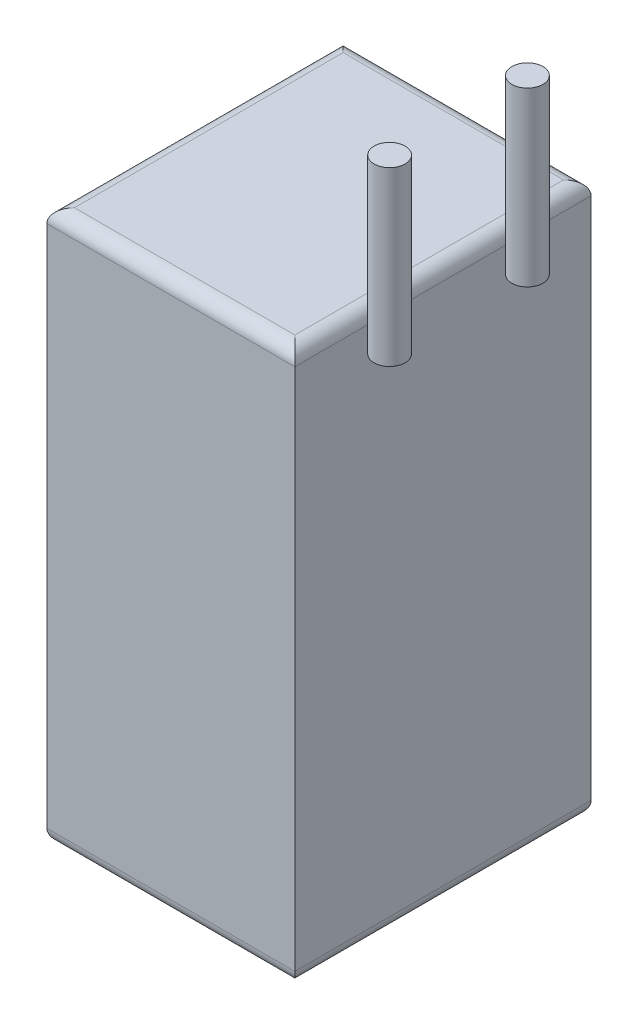
ISO-10303-21;
HEADER;
FILE_DESCRIPTION(('STEP AP214'),'2;1');
FILE_NAME('part.step','',(''),(''),'','','');
FILE_SCHEMA(('AUTOMOTIVE_DESIGN { 1 0 10303 214 1 1 1 1 }'));
ENDSEC;
DATA;
#1=APPLICATION_CONTEXT('core data for automotive mechanical design processes');
#2=APPLICATION_PROTOCOL_DEFINITION('international standard','automotive_design',2000,#1);
#3=PRODUCT_CONTEXT('',#1,'mechanical');
#4=PRODUCT('Part','Part','',(#3));
#5=PRODUCT_RELATED_PRODUCT_CATEGORY('part','',(#4));
#6=PRODUCT_DEFINITION_FORMATION('','',#4);
#7=PRODUCT_DEFINITION_CONTEXT('part definition',#1,'design');
#8=PRODUCT_DEFINITION('design','',#6,#7);
#9=PRODUCT_DEFINITION_SHAPE('','',#8);
#10=(LENGTH_UNIT() NAMED_UNIT(*) SI_UNIT(.MILLI.,.METRE.));
#11=(NAMED_UNIT(*) PLANE_ANGLE_UNIT() SI_UNIT($,.RADIAN.));
#12=(NAMED_UNIT(*) SI_UNIT($,.STERADIAN.) SOLID_ANGLE_UNIT());
#13=UNCERTAINTY_MEASURE_WITH_UNIT(LENGTH_MEASURE(1.E-05),#10,'distance_accuracy_value','');
#14=(GEOMETRIC_REPRESENTATION_CONTEXT(3) GLOBAL_UNCERTAINTY_ASSIGNED_CONTEXT((#13)) GLOBAL_UNIT_ASSIGNED_CONTEXT((#10,
#11,#12)) REPRESENTATION_CONTEXT('',''));
#15=CARTESIAN_POINT('',(0.,0.,0.));
#16=DIRECTION('',(0.,0.,1.));
#17=DIRECTION('',(1.,0.,0.));
#18=AXIS2_PLACEMENT_3D('',#15,#16,#17);
#19=CARTESIAN_POINT('',(20.25,75.,10.));
#20=DIRECTION('',(0.,1.,0.));
#21=DIRECTION('',(0.,0.,1.));
#22=AXIS2_PLACEMENT_3D('',#19,#20,#21);
#23=CYLINDRICAL_SURFACE('',#22,2.25);
#24=CARTESIAN_POINT('',(20.25,75.,10.));
#25=DIRECTION('',(0.,1.,0.));
#26=DIRECTION('',(0.,0.,-1.));
#27=AXIS2_PLACEMENT_3D('',#24,#25,#26);
#28=CIRCLE('',#27,2.25);
#29=CARTESIAN_POINT('',(20.25,75.,7.75));
#30=VERTEX_POINT('',#29);
#31=EDGE_CURVE('E11',#30,#30,#28,.T.);
#32=ORIENTED_EDGE('',*,*,#31,.T.);
#33=EDGE_LOOP('',(#32));
#34=FACE_BOUND('',#33,.T.);
#35=CARTESIAN_POINT('',(20.25,100.,10.));
#36=DIRECTION('',(0.,1.,0.));
#37=DIRECTION('',(0.,0.,-1.));
#38=AXIS2_PLACEMENT_3D('',#35,#36,#37);
#39=CIRCLE('',#38,2.25);
#40=CARTESIAN_POINT('',(20.25,100.,7.75));
#41=VERTEX_POINT('',#40);
#42=EDGE_CURVE('E54',#41,#41,#39,.T.);
#43=ORIENTED_EDGE('',*,*,#42,.F.);
#44=EDGE_LOOP('',(#43));
#45=FACE_BOUND('',#44,.T.);
#46=ADVANCED_FACE('F48',(#34,#45),#23,.T.);
#47=CARTESIAN_POINT('',(20.25,75.,10.));
#48=DIRECTION('',(0.,-1.,0.));
#49=DIRECTION('',(0.,0.,-1.));
#50=AXIS2_PLACEMENT_3D('',#47,#48,#49);
#51=PLANE('',#50);
#52=ORIENTED_EDGE('',*,*,#31,.F.);
#53=EDGE_LOOP('',(#52));
#54=FACE_BOUND('',#53,.T.);
#55=ADVANCED_FACE('F63',(#54),#51,.T.);
#56=CARTESIAN_POINT('',(20.25,100.,10.));
#57=DIRECTION('',(0.,-1.,0.));
#58=DIRECTION('',(0.,0.,-1.));
#59=AXIS2_PLACEMENT_3D('',#56,#57,#58);
#60=PLANE('',#59);
#61=ORIENTED_EDGE('',*,*,#42,.T.);
#62=EDGE_LOOP('',(#61));
#63=FACE_BOUND('',#62,.T.);
#64=ADVANCED_FACE('F60',(#63),#60,.F.);
#65=CLOSED_SHELL('',(#46,#55,#64));
#66=MANIFOLD_SOLID_BREP('B2',#65);
#67=CARTESIAN_POINT('',(20.25,75.,-10.));
#68=DIRECTION('',(0.,1.,0.));
#69=DIRECTION('',(0.,0.,1.));
#70=AXIS2_PLACEMENT_3D('',#67,#68,#69);
#71=CYLINDRICAL_SURFACE('',#70,2.25);
#72=CARTESIAN_POINT('',(20.25,75.,-10.));
#73=DIRECTION('',(0.,1.,0.));
#74=DIRECTION('',(0.,0.,1.));
#75=AXIS2_PLACEMENT_3D('',#72,#73,#74);
#76=CIRCLE('',#75,2.25);
#77=CARTESIAN_POINT('',(20.25,75.,-7.75));
#78=VERTEX_POINT('',#77);
#79=EDGE_CURVE('E47',#78,#78,#76,.T.);
#80=ORIENTED_EDGE('',*,*,#79,.T.);
#81=EDGE_LOOP('',(#80));
#82=FACE_BOUND('',#81,.T.);
#83=CARTESIAN_POINT('',(20.25,100.,-10.));
#84=DIRECTION('',(0.,1.,0.));
#85=DIRECTION('',(0.,0.,1.));
#86=AXIS2_PLACEMENT_3D('',#83,#84,#85);
#87=CIRCLE('',#86,2.25);
#88=CARTESIAN_POINT('',(20.25,100.,-7.75));
#89=VERTEX_POINT('',#88);
#90=EDGE_CURVE('E110',#89,#89,#87,.T.);
#91=ORIENTED_EDGE('',*,*,#90,.F.);
#92=EDGE_LOOP('',(#91));
#93=FACE_BOUND('',#92,.T.);
#94=ADVANCED_FACE('F104',(#82,#93),#71,.T.);
#95=CARTESIAN_POINT('',(20.25,75.,-10.));
#96=DIRECTION('',(0.,1.,0.));
#97=DIRECTION('',(0.,0.,1.));
#98=AXIS2_PLACEMENT_3D('',#95,#96,#97);
#99=PLANE('',#98);
#100=ORIENTED_EDGE('',*,*,#79,.F.);
#101=EDGE_LOOP('',(#100));
#102=FACE_BOUND('',#101,.T.);
#103=ADVANCED_FACE('F119',(#102),#99,.F.);
#104=CARTESIAN_POINT('',(20.25,100.,-10.));
#105=DIRECTION('',(0.,1.,0.));
#106=DIRECTION('',(0.,0.,1.));
#107=AXIS2_PLACEMENT_3D('',#104,#105,#106);
#108=PLANE('',#107);
#109=ORIENTED_EDGE('',*,*,#90,.T.);
#110=EDGE_LOOP('',(#109));
#111=FACE_BOUND('',#110,.T.);
#112=ADVANCED_FACE('F116',(#111),#108,.T.);
#113=CLOSED_SHELL('',(#94,#103,#112));
#114=MANIFOLD_SOLID_BREP('B6',#113);
#115=CARTESIAN_POINT('',(18.,80.,-21.5));
#116=DIRECTION('',(-1.,0.,0.));
#117=DIRECTION('',(0.,0.,1.));
#118=AXIS2_PLACEMENT_3D('',#115,#116,#117);
#119=PLANE('',#118);
#120=DIRECTION('',(0.,-1.,0.));
#121=VECTOR('',#120,1.);
#122=CARTESIAN_POINT('',(18.,80.,-21.5));
#123=LINE('',#122,#121);
#124=CARTESIAN_POINT('',(18.,78.,-21.5));
#125=VERTEX_POINT('',#124);
#126=CARTESIAN_POINT('',(18.,2.,-21.5));
#127=VERTEX_POINT('',#126);
#128=EDGE_CURVE('E239',#125,#127,#123,.T.);
#129=ORIENTED_EDGE('',*,*,#128,.F.);
#130=DIRECTION('',(0.,0.,-1.));
#131=VECTOR('',#130,1.);
#132=CARTESIAN_POINT('',(18.,78.,21.5));
#133=LINE('',#132,#131);
#134=CARTESIAN_POINT('',(18.,78.,21.5));
#135=VERTEX_POINT('',#134);
#136=EDGE_CURVE('E272',#125,#135,#133,.F.);
#137=ORIENTED_EDGE('',*,*,#136,.T.);
#138=DIRECTION('',(0.,-1.,0.));
#139=VECTOR('',#138,1.);
#140=CARTESIAN_POINT('',(18.,80.,21.5));
#141=LINE('',#140,#139);
#142=CARTESIAN_POINT('',(18.,2.,21.5));
#143=VERTEX_POINT('',#142);
#144=EDGE_CURVE('E290',#135,#143,#141,.T.);
#145=ORIENTED_EDGE('',*,*,#144,.T.);
#146=DIRECTION('',(0.,0.,-1.));
#147=VECTOR('',#146,1.);
#148=CARTESIAN_POINT('',(18.,2.,-21.5));
#149=LINE('',#148,#147);
#150=EDGE_CURVE('E269',#143,#127,#149,.T.);
#151=ORIENTED_EDGE('',*,*,#150,.T.);
#152=EDGE_LOOP('',(#129,#137,#145,#151));
#153=FACE_BOUND('',#152,.T.);
#154=ADVANCED_FACE('F151',(#153),#119,.F.);
#155=CARTESIAN_POINT('',(-18.,80.,-21.5));
#156=DIRECTION('',(0.,0.,1.));
#157=DIRECTION('',(1.,0.,0.));
#158=AXIS2_PLACEMENT_3D('',#155,#156,#157);
#159=PLANE('',#158);
#160=DIRECTION('',(0.,-1.,0.));
#161=VECTOR('',#160,1.);
#162=CARTESIAN_POINT('',(-18.,80.,-21.5));
#163=LINE('',#162,#161);
#164=CARTESIAN_POINT('',(-18.,78.,-21.5));
#165=VERTEX_POINT('',#164);
#166=CARTESIAN_POINT('',(-18.,2.,-21.5));
#167=VERTEX_POINT('',#166);
#168=EDGE_CURVE('E422',#165,#167,#163,.T.);
#169=ORIENTED_EDGE('',*,*,#168,.F.);
#170=DIRECTION('',(-1.,0.,0.));
#171=VECTOR('',#170,1.);
#172=CARTESIAN_POINT('',(18.,78.,-21.5));
#173=LINE('',#172,#171);
#174=EDGE_CURVE('E266',#165,#125,#173,.F.);
#175=ORIENTED_EDGE('',*,*,#174,.T.);
#176=ORIENTED_EDGE('',*,*,#128,.T.);
#177=DIRECTION('',(-1.,0.,0.));
#178=VECTOR('',#177,1.);
#179=CARTESIAN_POINT('',(-18.,2.,-21.5));
#180=LINE('',#179,#178);
#181=EDGE_CURVE('E262',#127,#167,#180,.T.);
#182=ORIENTED_EDGE('',*,*,#181,.T.);
#183=EDGE_LOOP('',(#169,#175,#176,#182));
#184=FACE_BOUND('',#183,.T.);
#185=ADVANCED_FACE('F331',(#184),#159,.F.);
#186=CARTESIAN_POINT('',(-18.,80.,-21.5));
#187=DIRECTION('',(1.,0.,0.));
#188=DIRECTION('',(0.,0.,-1.));
#189=AXIS2_PLACEMENT_3D('',#186,#187,#188);
#190=PLANE('',#189);
#191=DIRECTION('',(0.,-1.,0.));
#192=VECTOR('',#191,1.);
#193=CARTESIAN_POINT('',(-18.,80.,21.5));
#194=LINE('',#193,#192);
#195=CARTESIAN_POINT('',(-18.,78.,21.5));
#196=VERTEX_POINT('',#195);
#197=CARTESIAN_POINT('',(-18.,2.,21.5));
#198=VERTEX_POINT('',#197);
#199=EDGE_CURVE('E417',#196,#198,#194,.T.);
#200=ORIENTED_EDGE('',*,*,#199,.F.);
#201=DIRECTION('',(0.,0.,1.));
#202=VECTOR('',#201,1.);
#203=CARTESIAN_POINT('',(-18.,78.,-21.5));
#204=LINE('',#203,#202);
#205=EDGE_CURVE('E259',#196,#165,#204,.F.);
#206=ORIENTED_EDGE('',*,*,#205,.T.);
#207=ORIENTED_EDGE('',*,*,#168,.T.);
#208=DIRECTION('',(0.,0.,1.));
#209=VECTOR('',#208,1.);
#210=CARTESIAN_POINT('',(-18.,2.,-21.5));
#211=LINE('',#210,#209);
#212=EDGE_CURVE('E256',#167,#198,#211,.T.);
#213=ORIENTED_EDGE('',*,*,#212,.T.);
#214=EDGE_LOOP('',(#200,#206,#207,#213));
#215=FACE_BOUND('',#214,.T.);
#216=ADVANCED_FACE('F337',(#215),#190,.F.);
#217=CARTESIAN_POINT('',(-18.,80.,21.5));
#218=DIRECTION('',(0.,0.,-1.));
#219=DIRECTION('',(-1.,0.,0.));
#220=AXIS2_PLACEMENT_3D('',#217,#218,#219);
#221=PLANE('',#220);
#222=ORIENTED_EDGE('',*,*,#144,.F.);
#223=DIRECTION('',(1.,0.,0.));
#224=VECTOR('',#223,1.);
#225=CARTESIAN_POINT('',(-18.,78.,21.5));
#226=LINE('',#225,#224);
#227=EDGE_CURVE('E224',#135,#196,#226,.F.);
#228=ORIENTED_EDGE('',*,*,#227,.T.);
#229=ORIENTED_EDGE('',*,*,#199,.T.);
#230=DIRECTION('',(1.,0.,0.));
#231=VECTOR('',#230,1.);
#232=CARTESIAN_POINT('',(-18.,2.,21.5));
#233=LINE('',#232,#231);
#234=EDGE_CURVE('E246',#198,#143,#233,.T.);
#235=ORIENTED_EDGE('',*,*,#234,.T.);
#236=EDGE_LOOP('',(#222,#228,#229,#235));
#237=FACE_BOUND('',#236,.T.);
#238=ADVANCED_FACE('F327',(#237),#221,.F.);
#239=CARTESIAN_POINT('',(0.,80.,0.));
#240=DIRECTION('',(0.,1.,0.));
#241=DIRECTION('',(0.,0.,1.));
#242=AXIS2_PLACEMENT_3D('',#239,#240,#241);
#243=PLANE('',#242);
#244=DIRECTION('',(0.,0.,1.));
#245=VECTOR('',#244,1.);
#246=CARTESIAN_POINT('',(-16.,80.,21.5));
#247=LINE('',#246,#245);
#248=CARTESIAN_POINT('',(-16.,80.,-19.5));
#249=VERTEX_POINT('',#248);
#250=CARTESIAN_POINT('',(-16.,80.,19.5));
#251=VERTEX_POINT('',#250);
#252=EDGE_CURVE('E243',#249,#251,#247,.T.);
#253=ORIENTED_EDGE('',*,*,#252,.T.);
#254=DIRECTION('',(1.,0.,0.));
#255=VECTOR('',#254,1.);
#256=CARTESIAN_POINT('',(18.,80.,19.5));
#257=LINE('',#256,#255);
#258=CARTESIAN_POINT('',(16.,80.,19.5));
#259=VERTEX_POINT('',#258);
#260=EDGE_CURVE('E222',#251,#259,#257,.T.);
#261=ORIENTED_EDGE('',*,*,#260,.T.);
#262=DIRECTION('',(0.,0.,-1.));
#263=VECTOR('',#262,1.);
#264=CARTESIAN_POINT('',(16.,80.,-21.5));
#265=LINE('',#264,#263);
#266=CARTESIAN_POINT('',(16.,80.,-19.5));
#267=VERTEX_POINT('',#266);
#268=EDGE_CURVE('E231',#259,#267,#265,.T.);
#269=ORIENTED_EDGE('',*,*,#268,.T.);
#270=DIRECTION('',(-1.,0.,0.));
#271=VECTOR('',#270,1.);
#272=CARTESIAN_POINT('',(-18.,80.,-19.5));
#273=LINE('',#272,#271);
#274=EDGE_CURVE('E238',#267,#249,#273,.T.);
#275=ORIENTED_EDGE('',*,*,#274,.T.);
#276=EDGE_LOOP('',(#253,#261,#269,#275));
#277=FACE_BOUND('',#276,.T.);
#278=ADVANCED_FACE('F241',(#277),#243,.T.);
#279=CARTESIAN_POINT('',(0.,0.,0.));
#280=DIRECTION('',(0.,1.,0.));
#281=DIRECTION('',(0.,0.,1.));
#282=AXIS2_PLACEMENT_3D('',#279,#280,#281);
#283=PLANE('',#282);
#284=DIRECTION('',(0.,0.,1.));
#285=VECTOR('',#284,1.);
#286=CARTESIAN_POINT('',(-16.,0.,0.));
#287=LINE('',#286,#285);
#288=CARTESIAN_POINT('',(-16.,0.,19.5));
#289=VERTEX_POINT('',#288);
#290=CARTESIAN_POINT('',(-16.,0.,-19.5));
#291=VERTEX_POINT('',#290);
#292=EDGE_CURVE('E161',#289,#291,#287,.F.);
#293=ORIENTED_EDGE('',*,*,#292,.T.);
#294=DIRECTION('',(-1.,0.,0.));
#295=VECTOR('',#294,1.);
#296=CARTESIAN_POINT('',(0.,0.,-19.5));
#297=LINE('',#296,#295);
#298=CARTESIAN_POINT('',(16.,0.,-19.5));
#299=VERTEX_POINT('',#298);
#300=EDGE_CURVE('E102',#291,#299,#297,.F.);
#301=ORIENTED_EDGE('',*,*,#300,.T.);
#302=DIRECTION('',(0.,0.,-1.));
#303=VECTOR('',#302,1.);
#304=CARTESIAN_POINT('',(16.,0.,0.));
#305=LINE('',#304,#303);
#306=CARTESIAN_POINT('',(16.,0.,19.5));
#307=VERTEX_POINT('',#306);
#308=EDGE_CURVE('E275',#299,#307,#305,.F.);
#309=ORIENTED_EDGE('',*,*,#308,.T.);
#310=DIRECTION('',(1.,0.,0.));
#311=VECTOR('',#310,1.);
#312=CARTESIAN_POINT('',(0.,0.,19.5));
#313=LINE('',#312,#311);
#314=EDGE_CURVE('E172',#307,#289,#313,.F.);
#315=ORIENTED_EDGE('',*,*,#314,.T.);
#316=EDGE_LOOP('',(#293,#301,#309,#315));
#317=FACE_BOUND('',#316,.T.);
#318=ADVANCED_FACE('F316',(#317),#283,.F.);
#319=CARTESIAN_POINT('',(0.,78.,-19.5));
#320=DIRECTION('',(1.,0.,0.));
#321=DIRECTION('',(0.,0.,-1.));
#322=AXIS2_PLACEMENT_3D('',#319,#320,#321);
#323=CYLINDRICAL_SURFACE('',#322,2.);
#324=CARTESIAN_POINT('',(16.,78.,-19.5));
#325=DIRECTION('',(0.707106781186548,0.,0.707106781186547));
#326=DIRECTION('',(-0.707106781186547,0.,0.707106781186548));
#327=AXIS2_PLACEMENT_3D('',#324,#325,#326);
#328=ELLIPSE('',#327,2.82842712474619,2.);
#329=EDGE_CURVE('E234',#125,#267,#328,.T.);
#330=ORIENTED_EDGE('',*,*,#329,.F.);
#331=ORIENTED_EDGE('',*,*,#174,.F.);
#332=CARTESIAN_POINT('',(-16.,78.,-19.5));
#333=DIRECTION('',(0.707106781186547,0.,-0.707106781186548));
#334=DIRECTION('',(0.707106781186548,0.,0.707106781186547));
#335=AXIS2_PLACEMENT_3D('',#332,#333,#334);
#336=ELLIPSE('',#335,2.82842712474619,2.);
#337=EDGE_CURVE('E286',#249,#165,#336,.F.);
#338=ORIENTED_EDGE('',*,*,#337,.F.);
#339=ORIENTED_EDGE('',*,*,#274,.F.);
#340=EDGE_LOOP('',(#330,#331,#338,#339));
#341=FACE_BOUND('',#340,.T.);
#342=ADVANCED_FACE('F318',(#341),#323,.T.);
#343=CARTESIAN_POINT('',(-16.,78.,0.));
#344=DIRECTION('',(0.,0.,-1.));
#345=DIRECTION('',(-1.,0.,0.));
#346=AXIS2_PLACEMENT_3D('',#343,#344,#345);
#347=CYLINDRICAL_SURFACE('',#346,2.);
#348=ORIENTED_EDGE('',*,*,#337,.T.);
#349=ORIENTED_EDGE('',*,*,#205,.F.);
#350=CARTESIAN_POINT('',(-16.,78.,19.5));
#351=DIRECTION('',(-0.707106781186548,0.,-0.707106781186547));
#352=DIRECTION('',(0.707106781186547,0.,-0.707106781186548));
#353=AXIS2_PLACEMENT_3D('',#350,#351,#352);
#354=ELLIPSE('',#353,2.82842712474619,2.);
#355=EDGE_CURVE('E228',#251,#196,#354,.F.);
#356=ORIENTED_EDGE('',*,*,#355,.F.);
#357=ORIENTED_EDGE('',*,*,#252,.F.);
#358=EDGE_LOOP('',(#348,#349,#356,#357));
#359=FACE_BOUND('',#358,.T.);
#360=ADVANCED_FACE('F324',(#359),#347,.T.);
#361=CARTESIAN_POINT('',(16.,78.,0.));
#362=DIRECTION('',(0.,0.,1.));
#363=DIRECTION('',(1.,0.,0.));
#364=AXIS2_PLACEMENT_3D('',#361,#362,#363);
#365=CYLINDRICAL_SURFACE('',#364,2.);
#366=ORIENTED_EDGE('',*,*,#329,.T.);
#367=ORIENTED_EDGE('',*,*,#268,.F.);
#368=CARTESIAN_POINT('',(16.,78.,19.5));
#369=DIRECTION('',(-0.707106781186547,0.,0.707106781186548));
#370=DIRECTION('',(0.707106781186548,0.,0.707106781186547));
#371=AXIS2_PLACEMENT_3D('',#368,#369,#370);
#372=ELLIPSE('',#371,2.82842712474619,2.);
#373=EDGE_CURVE('E218',#135,#259,#372,.T.);
#374=ORIENTED_EDGE('',*,*,#373,.F.);
#375=ORIENTED_EDGE('',*,*,#136,.F.);
#376=EDGE_LOOP('',(#366,#367,#374,#375));
#377=FACE_BOUND('',#376,.T.);
#378=ADVANCED_FACE('F232',(#377),#365,.T.);
#379=CARTESIAN_POINT('',(0.,78.,19.5));
#380=DIRECTION('',(-1.,0.,0.));
#381=DIRECTION('',(0.,0.,1.));
#382=AXIS2_PLACEMENT_3D('',#379,#380,#381);
#383=CYLINDRICAL_SURFACE('',#382,2.);
#384=ORIENTED_EDGE('',*,*,#355,.T.);
#385=ORIENTED_EDGE('',*,*,#227,.F.);
#386=ORIENTED_EDGE('',*,*,#373,.T.);
#387=ORIENTED_EDGE('',*,*,#260,.F.);
#388=EDGE_LOOP('',(#384,#385,#386,#387));
#389=FACE_BOUND('',#388,.T.);
#390=ADVANCED_FACE('F220',(#389),#383,.T.);
#391=CARTESIAN_POINT('',(-18.,2.,19.5));
#392=DIRECTION('',(1.,0.,0.));
#393=DIRECTION('',(0.,0.,-1.));
#394=AXIS2_PLACEMENT_3D('',#391,#392,#393);
#395=CYLINDRICAL_SURFACE('',#394,2.);
#396=CARTESIAN_POINT('',(-16.,2.,19.5));
#397=DIRECTION('',(0.707106781186548,0.,0.707106781186547));
#398=DIRECTION('',(0.707106781186547,0.,-0.707106781186548));
#399=AXIS2_PLACEMENT_3D('',#396,#397,#398);
#400=ELLIPSE('',#399,2.82842712474619,2.);
#401=EDGE_CURVE('E296',#289,#198,#400,.F.);
#402=ORIENTED_EDGE('',*,*,#401,.F.);
#403=ORIENTED_EDGE('',*,*,#314,.F.);
#404=CARTESIAN_POINT('',(16.,2.,19.5));
#405=DIRECTION('',(0.707106781186547,0.,-0.707106781186548));
#406=DIRECTION('',(-0.707106781186548,0.,-0.707106781186547));
#407=AXIS2_PLACEMENT_3D('',#404,#405,#406);
#408=ELLIPSE('',#407,2.82842712474619,2.);
#409=EDGE_CURVE('E155',#143,#307,#408,.T.);
#410=ORIENTED_EDGE('',*,*,#409,.F.);
#411=ORIENTED_EDGE('',*,*,#234,.F.);
#412=EDGE_LOOP('',(#402,#403,#410,#411));
#413=FACE_BOUND('',#412,.T.);
#414=ADVANCED_FACE('F153',(#413),#395,.T.);
#415=CARTESIAN_POINT('',(16.,2.,-21.5));
#416=DIRECTION('',(0.,0.,-1.));
#417=DIRECTION('',(-1.,0.,0.));
#418=AXIS2_PLACEMENT_3D('',#415,#416,#417);
#419=CYLINDRICAL_SURFACE('',#418,2.);
#420=ORIENTED_EDGE('',*,*,#409,.T.);
#421=ORIENTED_EDGE('',*,*,#308,.F.);
#422=CARTESIAN_POINT('',(16.,2.,-19.5));
#423=DIRECTION('',(-0.707106781186548,0.,-0.707106781186547));
#424=DIRECTION('',(0.707106781186547,0.,-0.707106781186548));
#425=AXIS2_PLACEMENT_3D('',#422,#423,#424);
#426=ELLIPSE('',#425,2.82842712474619,2.);
#427=EDGE_CURVE('E294',#127,#299,#426,.T.);
#428=ORIENTED_EDGE('',*,*,#427,.F.);
#429=ORIENTED_EDGE('',*,*,#150,.F.);
#430=EDGE_LOOP('',(#420,#421,#428,#429));
#431=FACE_BOUND('',#430,.T.);
#432=ADVANCED_FACE('F307',(#431),#419,.T.);
#433=CARTESIAN_POINT('',(-16.,2.,-21.5));
#434=DIRECTION('',(0.,0.,1.));
#435=DIRECTION('',(1.,0.,0.));
#436=AXIS2_PLACEMENT_3D('',#433,#434,#435);
#437=CYLINDRICAL_SURFACE('',#436,2.);
#438=ORIENTED_EDGE('',*,*,#401,.T.);
#439=ORIENTED_EDGE('',*,*,#212,.F.);
#440=CARTESIAN_POINT('',(-16.,2.,-19.5));
#441=DIRECTION('',(-0.707106781186547,0.,0.707106781186548));
#442=DIRECTION('',(0.707106781186548,0.,0.707106781186547));
#443=AXIS2_PLACEMENT_3D('',#440,#441,#442);
#444=ELLIPSE('',#443,2.82842712474619,2.);
#445=EDGE_CURVE('E291',#291,#167,#444,.F.);
#446=ORIENTED_EDGE('',*,*,#445,.F.);
#447=ORIENTED_EDGE('',*,*,#292,.F.);
#448=EDGE_LOOP('',(#438,#439,#446,#447));
#449=FACE_BOUND('',#448,.T.);
#450=ADVANCED_FACE('F312',(#449),#437,.T.);
#451=CARTESIAN_POINT('',(-18.,2.,-19.5));
#452=DIRECTION('',(-1.,0.,0.));
#453=DIRECTION('',(0.,0.,1.));
#454=AXIS2_PLACEMENT_3D('',#451,#452,#453);
#455=CYLINDRICAL_SURFACE('',#454,2.);
#456=ORIENTED_EDGE('',*,*,#427,.T.);
#457=ORIENTED_EDGE('',*,*,#300,.F.);
#458=ORIENTED_EDGE('',*,*,#445,.T.);
#459=ORIENTED_EDGE('',*,*,#181,.F.);
#460=EDGE_LOOP('',(#456,#457,#458,#459));
#461=FACE_BOUND('',#460,.T.);
#462=ADVANCED_FACE('F315',(#461),#455,.T.);
#463=CLOSED_SHELL('',(#154,#185,#216,#238,#278,#318,#342,#360,#378,#390,#414,#432,#450,#462));
#464=MANIFOLD_SOLID_BREP('B42',#463);
#465=ADVANCED_BREP_SHAPE_REPRESENTATION('',(#18,#66,#114,#464),#14);
#466=SHAPE_DEFINITION_REPRESENTATION(#9,#465);
ENDSEC;
END-ISO-10303-21;
